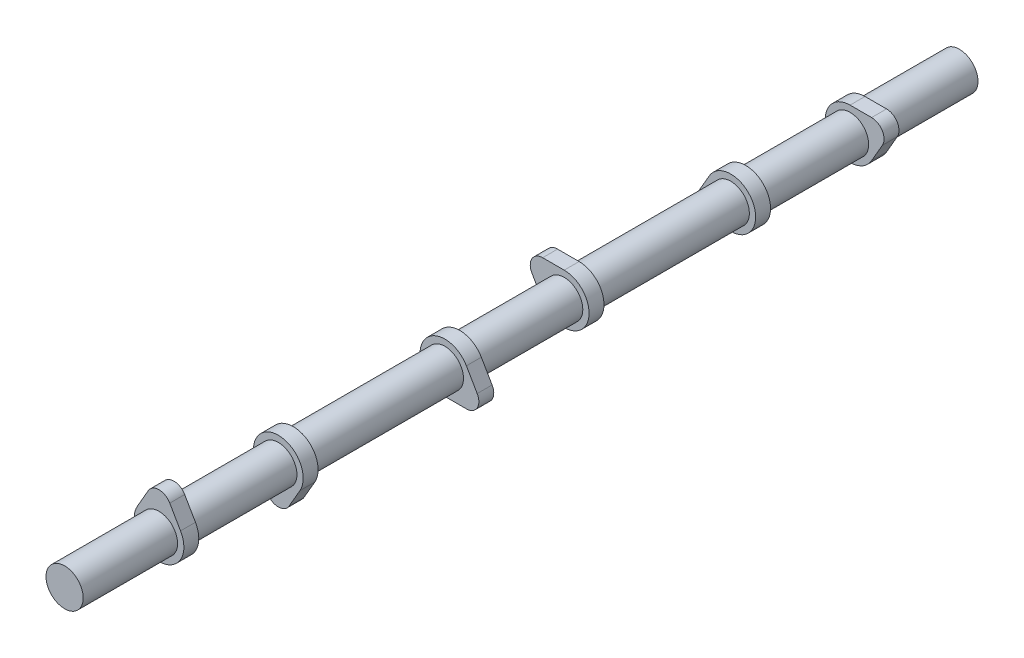
ISO-10303-21;
HEADER;
FILE_DESCRIPTION(('STEP AP214'),'2;1');
FILE_NAME('part.step','',(''),(''),'','','');
FILE_SCHEMA(('AUTOMOTIVE_DESIGN { 1 0 10303 214 1 1 1 1 }'));
ENDSEC;
DATA;
#1=APPLICATION_CONTEXT('core data for automotive mechanical design processes');
#2=APPLICATION_PROTOCOL_DEFINITION('international standard','automotive_design',2000,#1);
#3=PRODUCT_CONTEXT('',#1,'mechanical');
#4=PRODUCT('Part','Part','',(#3));
#5=PRODUCT_RELATED_PRODUCT_CATEGORY('part','',(#4));
#6=PRODUCT_DEFINITION_FORMATION('','',#4);
#7=PRODUCT_DEFINITION_CONTEXT('part definition',#1,'design');
#8=PRODUCT_DEFINITION('design','',#6,#7);
#9=PRODUCT_DEFINITION_SHAPE('','',#8);
#10=(LENGTH_UNIT() NAMED_UNIT(*) SI_UNIT(.MILLI.,.METRE.));
#11=(NAMED_UNIT(*) PLANE_ANGLE_UNIT() SI_UNIT($,.RADIAN.));
#12=(NAMED_UNIT(*) SI_UNIT($,.STERADIAN.) SOLID_ANGLE_UNIT());
#13=UNCERTAINTY_MEASURE_WITH_UNIT(LENGTH_MEASURE(1.E-05),#10,'distance_accuracy_value','');
#14=(GEOMETRIC_REPRESENTATION_CONTEXT(3) GLOBAL_UNCERTAINTY_ASSIGNED_CONTEXT((#13)) GLOBAL_UNIT_ASSIGNED_CONTEXT((#10,
#11,#12)) REPRESENTATION_CONTEXT('',''));
#15=CARTESIAN_POINT('',(0.,0.,0.));
#16=DIRECTION('',(0.,0.,1.));
#17=DIRECTION('',(1.,0.,0.));
#18=AXIS2_PLACEMENT_3D('',#15,#16,#17);
#19=CARTESIAN_POINT('',(0.,0.,-52.02));
#20=DIRECTION('',(0.,0.,1.));
#21=DIRECTION('',(1.,0.,0.));
#22=AXIS2_PLACEMENT_3D('',#19,#20,#21);
#23=CYLINDRICAL_SURFACE('',#22,9.5);
#24=CARTESIAN_POINT('',(0.,0.,295.81));
#25=DIRECTION('',(0.,0.,1.));
#26=DIRECTION('',(1.,0.,0.));
#27=AXIS2_PLACEMENT_3D('',#24,#25,#26);
#28=CIRCLE('',#27,9.5);
#29=CARTESIAN_POINT('',(9.5,0.,295.81));
#30=VERTEX_POINT('',#29);
#31=EDGE_CURVE('E297',#30,#30,#28,.T.);
#32=ORIENTED_EDGE('',*,*,#31,.T.);
#33=EDGE_LOOP('',(#32));
#34=FACE_BOUND('',#33,.T.);
#35=CARTESIAN_POINT('',(0.,0.,349.13));
#36=DIRECTION('',(0.,0.,1.));
#37=DIRECTION('',(1.,0.,0.));
#38=AXIS2_PLACEMENT_3D('',#35,#36,#37);
#39=CIRCLE('',#38,9.5);
#40=CARTESIAN_POINT('',(9.5,0.,349.13));
#41=VERTEX_POINT('',#40);
#42=EDGE_CURVE('E11',#41,#41,#39,.T.);
#43=ORIENTED_EDGE('',*,*,#42,.F.);
#44=EDGE_LOOP('',(#43));
#45=FACE_BOUND('',#44,.T.);
#46=ADVANCED_FACE('F45',(#34,#45),#23,.T.);
#47=CARTESIAN_POINT('',(0.,0.,210.75));
#48=DIRECTION('',(0.,0.,1.));
#49=DIRECTION('',(1.,0.,0.));
#50=AXIS2_PLACEMENT_3D('',#47,#48,#49);
#51=CIRCLE('',#50,9.5);
#52=CARTESIAN_POINT('',(9.5,0.,210.75));
#53=VERTEX_POINT('',#52);
#54=EDGE_CURVE('E340',#53,#53,#51,.T.);
#55=ORIENTED_EDGE('',*,*,#54,.T.);
#56=EDGE_LOOP('',(#55));
#57=FACE_BOUND('',#56,.T.);
#58=CARTESIAN_POINT('',(0.,0.,288.19));
#59=DIRECTION('',(0.,0.,1.));
#60=DIRECTION('',(1.,0.,0.));
#61=AXIS2_PLACEMENT_3D('',#58,#59,#60);
#62=CIRCLE('',#61,9.5);
#63=CARTESIAN_POINT('',(9.5,0.,288.19));
#64=VERTEX_POINT('',#63);
#65=EDGE_CURVE('E56',#64,#64,#62,.T.);
#66=ORIENTED_EDGE('',*,*,#65,.F.);
#67=EDGE_LOOP('',(#66));
#68=FACE_BOUND('',#67,.T.);
#69=ADVANCED_FACE('F539',(#57,#68),#23,.T.);
#70=CARTESIAN_POINT('',(0.,0.,149.81));
#71=DIRECTION('',(0.,0.,1.));
#72=DIRECTION('',(1.,0.,0.));
#73=AXIS2_PLACEMENT_3D('',#70,#71,#72);
#74=CIRCLE('',#73,9.5);
#75=CARTESIAN_POINT('',(9.5,0.,149.81));
#76=VERTEX_POINT('',#75);
#77=EDGE_CURVE('E383',#76,#76,#74,.T.);
#78=ORIENTED_EDGE('',*,*,#77,.T.);
#79=EDGE_LOOP('',(#78));
#80=FACE_BOUND('',#79,.T.);
#81=CARTESIAN_POINT('',(0.,0.,203.13));
#82=DIRECTION('',(0.,0.,1.));
#83=DIRECTION('',(1.,0.,0.));
#84=AXIS2_PLACEMENT_3D('',#81,#82,#83);
#85=CIRCLE('',#84,9.5);
#86=CARTESIAN_POINT('',(9.5,0.,203.13));
#87=VERTEX_POINT('',#86);
#88=EDGE_CURVE('E487',#87,#87,#85,.T.);
#89=ORIENTED_EDGE('',*,*,#88,.F.);
#90=EDGE_LOOP('',(#89));
#91=FACE_BOUND('',#90,.T.);
#92=ADVANCED_FACE('F546',(#80,#91),#23,.T.);
#93=CARTESIAN_POINT('',(0.,0.,64.75));
#94=DIRECTION('',(0.,0.,1.));
#95=DIRECTION('',(1.,0.,0.));
#96=AXIS2_PLACEMENT_3D('',#93,#94,#95);
#97=CIRCLE('',#96,9.5);
#98=CARTESIAN_POINT('',(9.5,0.,64.75));
#99=VERTEX_POINT('',#98);
#100=EDGE_CURVE('E426',#99,#99,#97,.T.);
#101=ORIENTED_EDGE('',*,*,#100,.T.);
#102=EDGE_LOOP('',(#101));
#103=FACE_BOUND('',#102,.T.);
#104=CARTESIAN_POINT('',(0.,0.,142.19));
#105=DIRECTION('',(0.,0.,1.));
#106=DIRECTION('',(1.,0.,0.));
#107=AXIS2_PLACEMENT_3D('',#104,#105,#106);
#108=CIRCLE('',#107,9.5);
#109=CARTESIAN_POINT('',(9.5,0.,142.19));
#110=VERTEX_POINT('',#109);
#111=EDGE_CURVE('E480',#110,#110,#108,.T.);
#112=ORIENTED_EDGE('',*,*,#111,.F.);
#113=EDGE_LOOP('',(#112));
#114=FACE_BOUND('',#113,.T.);
#115=ADVANCED_FACE('F578',(#103,#114),#23,.T.);
#116=CARTESIAN_POINT('',(0.,0.,3.81));
#117=DIRECTION('',(0.,0.,1.));
#118=DIRECTION('',(1.,0.,0.));
#119=AXIS2_PLACEMENT_3D('',#116,#117,#118);
#120=CIRCLE('',#119,9.5);
#121=CARTESIAN_POINT('',(9.5,0.,3.81));
#122=VERTEX_POINT('',#121);
#123=EDGE_CURVE('E431',#122,#122,#120,.F.);
#124=ORIENTED_EDGE('',*,*,#123,.F.);
#125=EDGE_LOOP('',(#124));
#126=FACE_BOUND('',#125,.T.);
#127=CARTESIAN_POINT('',(0.,0.,57.13));
#128=DIRECTION('',(0.,0.,1.));
#129=DIRECTION('',(1.,0.,0.));
#130=AXIS2_PLACEMENT_3D('',#127,#128,#129);
#131=CIRCLE('',#130,9.5);
#132=CARTESIAN_POINT('',(9.5,0.,57.13));
#133=VERTEX_POINT('',#132);
#134=EDGE_CURVE('E476',#133,#133,#131,.T.);
#135=ORIENTED_EDGE('',*,*,#134,.F.);
#136=EDGE_LOOP('',(#135));
#137=FACE_BOUND('',#136,.T.);
#138=ADVANCED_FACE('F564',(#126,#137),#23,.T.);
#139=CARTESIAN_POINT('',(10.9985226280625,6.34999999999982,3.81));
#140=DIRECTION('',(0.,0.,-1.));
#141=DIRECTION('',(-0.499999999999986,0.866025403784447,0.));
#142=AXIS2_PLACEMENT_3D('',#139,#140,#141);
#143=CYLINDRICAL_SURFACE('',#142,6.35);
#144=CARTESIAN_POINT('',(10.9985226280625,6.34999999999982,-3.81));
#145=DIRECTION('',(0.,0.,1.));
#146=DIRECTION('',(0.499999999999986,-0.866025403784447,0.));
#147=AXIS2_PLACEMENT_3D('',#144,#145,#146);
#148=CIRCLE('',#147,6.35);
#149=CARTESIAN_POINT('',(16.4977839420936,3.17499999999973,-3.81));
#150=VERTEX_POINT('',#149);
#151=CARTESIAN_POINT('',(10.9985226280626,12.6999999999998,-3.81));
#152=VERTEX_POINT('',#151);
#153=EDGE_CURVE('E439',#150,#152,#148,.T.);
#154=ORIENTED_EDGE('',*,*,#153,.T.);
#155=DIRECTION('',(0.,0.,-1.));
#156=VECTOR('',#155,1.);
#157=CARTESIAN_POINT('',(10.9985226280626,12.6999999999998,3.81));
#158=LINE('',#157,#156);
#159=CARTESIAN_POINT('',(10.9985226280626,12.6999999999998,3.81));
#160=VERTEX_POINT('',#159);
#161=EDGE_CURVE('E469',#160,#152,#158,.T.);
#162=ORIENTED_EDGE('',*,*,#161,.F.);
#163=CARTESIAN_POINT('',(10.9985226280625,6.34999999999982,3.81));
#164=DIRECTION('',(0.,0.,1.));
#165=DIRECTION('',(0.499999999999986,-0.866025403784447,0.));
#166=AXIS2_PLACEMENT_3D('',#163,#164,#165);
#167=CIRCLE('',#166,6.35);
#168=CARTESIAN_POINT('',(16.4977839420936,3.17499999999973,3.81));
#169=VERTEX_POINT('',#168);
#170=EDGE_CURVE('E440',#169,#160,#167,.T.);
#171=ORIENTED_EDGE('',*,*,#170,.F.);
#172=DIRECTION('',(0.,0.,-1.));
#173=VECTOR('',#172,1.);
#174=CARTESIAN_POINT('',(16.4977839420936,3.17499999999973,3.81));
#175=LINE('',#174,#173);
#176=EDGE_CURVE('E450',#169,#150,#175,.T.);
#177=ORIENTED_EDGE('',*,*,#176,.T.);
#178=EDGE_LOOP('',(#154,#162,#171,#177));
#179=FACE_BOUND('',#178,.T.);
#180=ADVANCED_FACE('F47',(#179),#143,.T.);
#181=CARTESIAN_POINT('',(10.9985226280626,12.6999999999998,3.81));
#182=DIRECTION('',(0.,-1.,0.));
#183=DIRECTION('',(1.,0.,0.));
#184=AXIS2_PLACEMENT_3D('',#181,#182,#183);
#185=PLANE('',#184);
#186=DIRECTION('',(-1.,0.,0.));
#187=VECTOR('',#186,1.);
#188=CARTESIAN_POINT('',(10.9985226280626,12.6999999999998,-3.81));
#189=LINE('',#188,#187);
#190=CARTESIAN_POINT('',(2.05564731903252E-13,12.7,-3.81));
#191=VERTEX_POINT('',#190);
#192=EDGE_CURVE('E454',#152,#191,#189,.T.);
#193=ORIENTED_EDGE('',*,*,#192,.T.);
#194=DIRECTION('',(0.,0.,-1.));
#195=VECTOR('',#194,1.);
#196=CARTESIAN_POINT('',(2.05564731903252E-13,12.7,3.81));
#197=LINE('',#196,#195);
#198=CARTESIAN_POINT('',(2.05564731903252E-13,12.7,3.81));
#199=VERTEX_POINT('',#198);
#200=EDGE_CURVE('E466',#199,#191,#197,.T.);
#201=ORIENTED_EDGE('',*,*,#200,.F.);
#202=DIRECTION('',(-1.,0.,0.));
#203=VECTOR('',#202,1.);
#204=CARTESIAN_POINT('',(10.9985226280626,12.6999999999998,3.81));
#205=LINE('',#204,#203);
#206=EDGE_CURVE('E96',#160,#199,#205,.T.);
#207=ORIENTED_EDGE('',*,*,#206,.F.);
#208=ORIENTED_EDGE('',*,*,#161,.T.);
#209=EDGE_LOOP('',(#193,#201,#207,#208));
#210=FACE_BOUND('',#209,.T.);
#211=ADVANCED_FACE('F585',(#210),#185,.F.);
#212=CARTESIAN_POINT('',(0.,0.,3.81));
#213=DIRECTION('',(0.,0.,-1.));
#214=DIRECTION('',(-0.499999999999986,0.866025403784447,0.));
#215=AXIS2_PLACEMENT_3D('',#212,#213,#214);
#216=CYLINDRICAL_SURFACE('',#215,12.7);
#217=CARTESIAN_POINT('',(0.,0.,-3.81));
#218=DIRECTION('',(0.,0.,1.));
#219=DIRECTION('',(0.499999999999986,-0.866025403784447,0.));
#220=AXIS2_PLACEMENT_3D('',#217,#218,#219);
#221=CIRCLE('',#220,12.7);
#222=CARTESIAN_POINT('',(10.9985226280623,-6.35000000000018,-3.81));
#223=VERTEX_POINT('',#222);
#224=EDGE_CURVE('E82',#191,#223,#221,.T.);
#225=ORIENTED_EDGE('',*,*,#224,.T.);
#226=DIRECTION('',(0.,0.,-1.));
#227=VECTOR('',#226,1.);
#228=CARTESIAN_POINT('',(10.9985226280623,-6.35000000000018,3.81));
#229=LINE('',#228,#227);
#230=CARTESIAN_POINT('',(10.9985226280623,-6.35000000000018,3.81));
#231=VERTEX_POINT('',#230);
#232=EDGE_CURVE('E463',#231,#223,#229,.T.);
#233=ORIENTED_EDGE('',*,*,#232,.F.);
#234=CARTESIAN_POINT('',(0.,0.,3.81));
#235=DIRECTION('',(0.,0.,1.));
#236=DIRECTION('',(0.499999999999986,-0.866025403784447,0.));
#237=AXIS2_PLACEMENT_3D('',#234,#235,#236);
#238=CIRCLE('',#237,12.7);
#239=EDGE_CURVE('E445',#199,#231,#238,.T.);
#240=ORIENTED_EDGE('',*,*,#239,.F.);
#241=ORIENTED_EDGE('',*,*,#200,.T.);
#242=EDGE_LOOP('',(#225,#233,#240,#241));
#243=FACE_BOUND('',#242,.T.);
#244=ADVANCED_FACE('F936',(#243),#216,.T.);
#245=CARTESIAN_POINT('',(16.4977839420936,3.17499999999973,3.81));
#246=DIRECTION('',(-0.86602540378443,0.500000000000014,0.));
#247=DIRECTION('',(-0.500000000000014,-0.86602540378443,0.));
#248=AXIS2_PLACEMENT_3D('',#245,#246,#247);
#249=PLANE('',#248);
#250=DIRECTION('',(0.500000000000014,0.86602540378443,0.));
#251=VECTOR('',#250,1.);
#252=CARTESIAN_POINT('',(16.4977839420936,3.17499999999973,-3.81));
#253=LINE('',#252,#251);
#254=EDGE_CURVE('E88',#223,#150,#253,.T.);
#255=ORIENTED_EDGE('',*,*,#254,.T.);
#256=ORIENTED_EDGE('',*,*,#176,.F.);
#257=DIRECTION('',(0.500000000000014,0.86602540378443,0.));
#258=VECTOR('',#257,1.);
#259=CARTESIAN_POINT('',(16.4977839420936,3.17499999999973,3.81));
#260=LINE('',#259,#258);
#261=EDGE_CURVE('E64',#231,#169,#260,.T.);
#262=ORIENTED_EDGE('',*,*,#261,.F.);
#263=ORIENTED_EDGE('',*,*,#232,.T.);
#264=EDGE_LOOP('',(#255,#256,#262,#263));
#265=FACE_BOUND('',#264,.T.);
#266=ADVANCED_FACE('F920',(#265),#249,.F.);
#267=CARTESIAN_POINT('',(10.9985226280625,6.34999999999982,3.81));
#268=DIRECTION('',(0.,0.,1.));
#269=DIRECTION('',(0.499999999999986,-0.866025403784447,0.));
#270=AXIS2_PLACEMENT_3D('',#267,#268,#269);
#271=PLANE('',#270);
#272=ORIENTED_EDGE('',*,*,#123,.T.);
#273=EDGE_LOOP('',(#272));
#274=FACE_BOUND('',#273,.T.);
#275=ORIENTED_EDGE('',*,*,#170,.T.);
#276=ORIENTED_EDGE('',*,*,#206,.T.);
#277=ORIENTED_EDGE('',*,*,#239,.T.);
#278=ORIENTED_EDGE('',*,*,#261,.T.);
#279=EDGE_LOOP('',(#275,#276,#277,#278));
#280=FACE_BOUND('',#279,.T.);
#281=ADVANCED_FACE('F911',(#274,#280),#271,.T.);
#282=CARTESIAN_POINT('',(10.9985226280625,6.34999999999982,-3.81));
#283=DIRECTION('',(0.,0.,1.));
#284=DIRECTION('',(0.499999999999986,-0.866025403784447,0.));
#285=AXIS2_PLACEMENT_3D('',#282,#283,#284);
#286=PLANE('',#285);
#287=CARTESIAN_POINT('',(0.,0.,-3.81));
#288=DIRECTION('',(0.,0.,1.));
#289=DIRECTION('',(1.,0.,0.));
#290=AXIS2_PLACEMENT_3D('',#287,#288,#289);
#291=CIRCLE('',#290,9.5);
#292=CARTESIAN_POINT('',(9.5,0.,-3.81));
#293=VERTEX_POINT('',#292);
#294=EDGE_CURVE('E472',#293,#293,#291,.F.);
#295=ORIENTED_EDGE('',*,*,#294,.F.);
#296=EDGE_LOOP('',(#295));
#297=FACE_BOUND('',#296,.T.);
#298=ORIENTED_EDGE('',*,*,#153,.F.);
#299=ORIENTED_EDGE('',*,*,#254,.F.);
#300=ORIENTED_EDGE('',*,*,#224,.F.);
#301=ORIENTED_EDGE('',*,*,#192,.F.);
#302=EDGE_LOOP('',(#298,#299,#300,#301));
#303=FACE_BOUND('',#302,.T.);
#304=ADVANCED_FACE('F572',(#297,#303),#286,.F.);
#305=CARTESIAN_POINT('',(0.,0.,-52.02));
#306=DIRECTION('',(0.,0.,-1.));
#307=DIRECTION('',(-1.,0.,0.));
#308=AXIS2_PLACEMENT_3D('',#305,#306,#307);
#309=PLANE('',#308);
#310=CARTESIAN_POINT('',(0.,0.,-52.02));
#311=DIRECTION('',(0.,0.,-1.));
#312=DIRECTION('',(-1.,0.,0.));
#313=AXIS2_PLACEMENT_3D('',#310,#311,#312);
#314=CIRCLE('',#313,9.5);
#315=CARTESIAN_POINT('',(-9.5,0.,-52.02));
#316=VERTEX_POINT('',#315);
#317=EDGE_CURVE('E427',#316,#316,#314,.T.);
#318=ORIENTED_EDGE('',*,*,#317,.T.);
#319=EDGE_LOOP('',(#318));
#320=FACE_BOUND('',#319,.T.);
#321=ADVANCED_FACE('F562',(#320),#309,.T.);
#322=ORIENTED_EDGE('',*,*,#317,.F.);
#323=EDGE_LOOP('',(#322));
#324=FACE_BOUND('',#323,.T.);
#325=ORIENTED_EDGE('',*,*,#294,.T.);
#326=EDGE_LOOP('',(#325));
#327=FACE_BOUND('',#326,.T.);
#328=ADVANCED_FACE('F553',(#324,#327),#23,.T.);
#329=CARTESIAN_POINT('',(-10.9985226280624,-6.3499999999999,64.75));
#330=DIRECTION('',(0.,0.,-1.));
#331=DIRECTION('',(0.499999999999992,-0.866025403784443,0.));
#332=AXIS2_PLACEMENT_3D('',#329,#330,#331);
#333=CYLINDRICAL_SURFACE('',#332,6.35);
#334=CARTESIAN_POINT('',(-10.9985226280624,-6.3499999999999,57.13));
#335=DIRECTION('',(0.,0.,1.));
#336=DIRECTION('',(-0.499999999999992,0.866025403784443,0.));
#337=AXIS2_PLACEMENT_3D('',#334,#335,#336);
#338=CIRCLE('',#337,6.35);
#339=CARTESIAN_POINT('',(-16.4977839420936,-3.17499999999984,57.13));
#340=VERTEX_POINT('',#339);
#341=CARTESIAN_POINT('',(-10.9985226280625,-12.6999999999999,57.13));
#342=VERTEX_POINT('',#341);
#343=EDGE_CURVE('E399',#340,#342,#338,.T.);
#344=ORIENTED_EDGE('',*,*,#343,.T.);
#345=DIRECTION('',(0.,0.,-1.));
#346=VECTOR('',#345,1.);
#347=CARTESIAN_POINT('',(-10.9985226280625,-12.6999999999999,64.75));
#348=LINE('',#347,#346);
#349=CARTESIAN_POINT('',(-10.9985226280625,-12.6999999999999,64.75));
#350=VERTEX_POINT('',#349);
#351=EDGE_CURVE('E422',#350,#342,#348,.T.);
#352=ORIENTED_EDGE('',*,*,#351,.F.);
#353=CARTESIAN_POINT('',(-10.9985226280624,-6.3499999999999,64.75));
#354=DIRECTION('',(0.,0.,1.));
#355=DIRECTION('',(-0.499999999999992,0.866025403784443,0.));
#356=AXIS2_PLACEMENT_3D('',#353,#354,#355);
#357=CIRCLE('',#356,6.35);
#358=CARTESIAN_POINT('',(-16.4977839420936,-3.17499999999984,64.75));
#359=VERTEX_POINT('',#358);
#360=EDGE_CURVE('E384',#359,#350,#357,.T.);
#361=ORIENTED_EDGE('',*,*,#360,.F.);
#362=DIRECTION('',(0.,0.,-1.));
#363=VECTOR('',#362,1.);
#364=CARTESIAN_POINT('',(-16.4977839420936,-3.17499999999984,64.75));
#365=LINE('',#364,#363);
#366=EDGE_CURVE('E398',#359,#340,#365,.T.);
#367=ORIENTED_EDGE('',*,*,#366,.T.);
#368=EDGE_LOOP('',(#344,#352,#361,#367));
#369=FACE_BOUND('',#368,.T.);
#370=ADVANCED_FACE('F561',(#369),#333,.T.);
#371=CARTESIAN_POINT('',(-10.9985226280625,-12.6999999999999,64.75));
#372=DIRECTION('',(0.,1.,0.));
#373=DIRECTION('',(-1.,0.,0.));
#374=AXIS2_PLACEMENT_3D('',#371,#372,#373);
#375=PLANE('',#374);
#376=DIRECTION('',(1.,0.,0.));
#377=VECTOR('',#376,1.);
#378=CARTESIAN_POINT('',(-10.9985226280625,-12.6999999999999,57.13));
#379=LINE('',#378,#377);
#380=CARTESIAN_POINT('',(-1.16226472890446E-13,-12.7,57.13));
#381=VERTEX_POINT('',#380);
#382=EDGE_CURVE('E403',#342,#381,#379,.T.);
#383=ORIENTED_EDGE('',*,*,#382,.T.);
#384=DIRECTION('',(0.,0.,-1.));
#385=VECTOR('',#384,1.);
#386=CARTESIAN_POINT('',(-1.16226472890446E-13,-12.7,64.75));
#387=LINE('',#386,#385);
#388=CARTESIAN_POINT('',(-1.16226472890446E-13,-12.7,64.75));
#389=VERTEX_POINT('',#388);
#390=EDGE_CURVE('E418',#389,#381,#387,.T.);
#391=ORIENTED_EDGE('',*,*,#390,.F.);
#392=DIRECTION('',(1.,0.,0.));
#393=VECTOR('',#392,1.);
#394=CARTESIAN_POINT('',(-10.9985226280625,-12.6999999999999,64.75));
#395=LINE('',#394,#393);
#396=EDGE_CURVE('E388',#350,#389,#395,.T.);
#397=ORIENTED_EDGE('',*,*,#396,.F.);
#398=ORIENTED_EDGE('',*,*,#351,.T.);
#399=EDGE_LOOP('',(#383,#391,#397,#398));
#400=FACE_BOUND('',#399,.T.);
#401=ADVANCED_FACE('F569',(#400),#375,.F.);
#402=CARTESIAN_POINT('',(0.,0.,64.75));
#403=DIRECTION('',(0.,0.,-1.));
#404=DIRECTION('',(0.499999999999992,-0.866025403784443,0.));
#405=AXIS2_PLACEMENT_3D('',#402,#403,#404);
#406=CYLINDRICAL_SURFACE('',#405,12.7);
#407=CARTESIAN_POINT('',(0.,0.,57.13));
#408=DIRECTION('',(0.,0.,1.));
#409=DIRECTION('',(-0.499999999999992,0.866025403784443,0.));
#410=AXIS2_PLACEMENT_3D('',#407,#408,#409);
#411=CIRCLE('',#410,12.7);
#412=CARTESIAN_POINT('',(-10.9985226280623,6.3500000000001,57.13));
#413=VERTEX_POINT('',#412);
#414=EDGE_CURVE('E406',#381,#413,#411,.T.);
#415=ORIENTED_EDGE('',*,*,#414,.T.);
#416=DIRECTION('',(0.,0.,-1.));
#417=VECTOR('',#416,1.);
#418=CARTESIAN_POINT('',(-10.9985226280623,6.3500000000001,64.75));
#419=LINE('',#418,#417);
#420=CARTESIAN_POINT('',(-10.9985226280623,6.3500000000001,64.75));
#421=VERTEX_POINT('',#420);
#422=EDGE_CURVE('E414',#421,#413,#419,.T.);
#423=ORIENTED_EDGE('',*,*,#422,.F.);
#424=CARTESIAN_POINT('',(0.,0.,64.75));
#425=DIRECTION('',(0.,0.,1.));
#426=DIRECTION('',(-0.499999999999992,0.866025403784443,0.));
#427=AXIS2_PLACEMENT_3D('',#424,#425,#426);
#428=CIRCLE('',#427,12.7);
#429=EDGE_CURVE('E392',#389,#421,#428,.T.);
#430=ORIENTED_EDGE('',*,*,#429,.F.);
#431=ORIENTED_EDGE('',*,*,#390,.T.);
#432=EDGE_LOOP('',(#415,#423,#430,#431));
#433=FACE_BOUND('',#432,.T.);
#434=ADVANCED_FACE('F610',(#433),#406,.T.);
#435=CARTESIAN_POINT('',(-16.4977839420936,-3.17499999999984,64.75));
#436=DIRECTION('',(0.866025403784434,-0.500000000000008,0.));
#437=DIRECTION('',(0.500000000000008,0.866025403784434,0.));
#438=AXIS2_PLACEMENT_3D('',#435,#436,#437);
#439=PLANE('',#438);
#440=DIRECTION('',(-0.500000000000008,-0.866025403784434,0.));
#441=VECTOR('',#440,1.);
#442=CARTESIAN_POINT('',(-16.4977839420936,-3.17499999999984,57.13));
#443=LINE('',#442,#441);
#444=EDGE_CURVE('E389',#413,#340,#443,.T.);
#445=ORIENTED_EDGE('',*,*,#444,.T.);
#446=ORIENTED_EDGE('',*,*,#366,.F.);
#447=DIRECTION('',(-0.500000000000008,-0.866025403784434,0.));
#448=VECTOR('',#447,1.);
#449=CARTESIAN_POINT('',(-16.4977839420936,-3.17499999999984,64.75));
#450=LINE('',#449,#448);
#451=EDGE_CURVE('E395',#421,#359,#450,.T.);
#452=ORIENTED_EDGE('',*,*,#451,.F.);
#453=ORIENTED_EDGE('',*,*,#422,.T.);
#454=EDGE_LOOP('',(#445,#446,#452,#453));
#455=FACE_BOUND('',#454,.T.);
#456=ADVANCED_FACE('F606',(#455),#439,.F.);
#457=CARTESIAN_POINT('',(-10.9985226280624,-6.3499999999999,64.75));
#458=DIRECTION('',(0.,0.,1.));
#459=DIRECTION('',(-0.499999999999992,0.866025403784443,0.));
#460=AXIS2_PLACEMENT_3D('',#457,#458,#459);
#461=PLANE('',#460);
#462=ORIENTED_EDGE('',*,*,#100,.F.);
#463=EDGE_LOOP('',(#462));
#464=FACE_BOUND('',#463,.T.);
#465=ORIENTED_EDGE('',*,*,#360,.T.);
#466=ORIENTED_EDGE('',*,*,#396,.T.);
#467=ORIENTED_EDGE('',*,*,#429,.T.);
#468=ORIENTED_EDGE('',*,*,#451,.T.);
#469=EDGE_LOOP('',(#465,#466,#467,#468));
#470=FACE_BOUND('',#469,.T.);
#471=ADVANCED_FACE('F596',(#464,#470),#461,.T.);
#472=CARTESIAN_POINT('',(-10.9985226280624,-6.3499999999999,57.13));
#473=DIRECTION('',(0.,0.,1.));
#474=DIRECTION('',(-0.499999999999992,0.866025403784443,0.));
#475=AXIS2_PLACEMENT_3D('',#472,#473,#474);
#476=PLANE('',#475);
#477=ORIENTED_EDGE('',*,*,#134,.T.);
#478=EDGE_LOOP('',(#477));
#479=FACE_BOUND('',#478,.T.);
#480=ORIENTED_EDGE('',*,*,#343,.F.);
#481=ORIENTED_EDGE('',*,*,#444,.F.);
#482=ORIENTED_EDGE('',*,*,#414,.F.);
#483=ORIENTED_EDGE('',*,*,#382,.F.);
#484=EDGE_LOOP('',(#480,#481,#482,#483));
#485=FACE_BOUND('',#484,.T.);
#486=ADVANCED_FACE('F592',(#479,#485),#476,.F.);
#487=CARTESIAN_POINT('',(-10.9985226280623,6.35000000000013,149.81));
#488=DIRECTION('',(0.,0.,-1.));
#489=DIRECTION('',(-0.50000000000001,-0.866025403784433,0.));
#490=AXIS2_PLACEMENT_3D('',#487,#488,#489);
#491=CYLINDRICAL_SURFACE('',#490,6.35);
#492=CARTESIAN_POINT('',(-10.9985226280623,6.35000000000013,142.19));
#493=DIRECTION('',(0.,0.,1.));
#494=DIRECTION('',(0.50000000000001,0.866025403784433,0.));
#495=AXIS2_PLACEMENT_3D('',#492,#493,#494);
#496=CIRCLE('',#495,6.35);
#497=CARTESIAN_POINT('',(-10.9985226280622,12.7000000000001,142.19));
#498=VERTEX_POINT('',#497);
#499=CARTESIAN_POINT('',(-16.4977839420935,3.17500000000019,142.19));
#500=VERTEX_POINT('',#499);
#501=EDGE_CURVE('E356',#498,#500,#496,.T.);
#502=ORIENTED_EDGE('',*,*,#501,.T.);
#503=DIRECTION('',(0.,0.,-1.));
#504=VECTOR('',#503,1.);
#505=CARTESIAN_POINT('',(-16.4977839420935,3.17500000000019,149.81));
#506=LINE('',#505,#504);
#507=CARTESIAN_POINT('',(-16.4977839420935,3.17500000000019,149.81));
#508=VERTEX_POINT('',#507);
#509=EDGE_CURVE('E379',#508,#500,#506,.T.);
#510=ORIENTED_EDGE('',*,*,#509,.F.);
#511=CARTESIAN_POINT('',(-10.9985226280623,6.35000000000013,149.81));
#512=DIRECTION('',(0.,0.,1.));
#513=DIRECTION('',(0.50000000000001,0.866025403784433,0.));
#514=AXIS2_PLACEMENT_3D('',#511,#512,#513);
#515=CIRCLE('',#514,6.35);
#516=CARTESIAN_POINT('',(-10.9985226280622,12.7000000000001,149.81));
#517=VERTEX_POINT('',#516);
#518=EDGE_CURVE('E341',#517,#508,#515,.T.);
#519=ORIENTED_EDGE('',*,*,#518,.F.);
#520=DIRECTION('',(0.,0.,-1.));
#521=VECTOR('',#520,1.);
#522=CARTESIAN_POINT('',(-10.9985226280622,12.7000000000001,149.81));
#523=LINE('',#522,#521);
#524=EDGE_CURVE('E355',#517,#498,#523,.T.);
#525=ORIENTED_EDGE('',*,*,#524,.T.);
#526=EDGE_LOOP('',(#502,#510,#519,#525));
#527=FACE_BOUND('',#526,.T.);
#528=ADVANCED_FACE('F595',(#527),#491,.T.);
#529=CARTESIAN_POINT('',(-16.4977839420935,3.17500000000019,149.81));
#530=DIRECTION('',(0.866025403784445,0.49999999999999,0.));
#531=DIRECTION('',(-0.49999999999999,0.866025403784445,0.));
#532=AXIS2_PLACEMENT_3D('',#529,#530,#531);
#533=PLANE('',#532);
#534=DIRECTION('',(0.49999999999999,-0.866025403784445,0.));
#535=VECTOR('',#534,1.);
#536=CARTESIAN_POINT('',(-16.4977839420935,3.17500000000019,142.19));
#537=LINE('',#536,#535);
#538=CARTESIAN_POINT('',(-10.9985226280624,-6.34999999999987,142.19));
#539=VERTEX_POINT('',#538);
#540=EDGE_CURVE('E360',#500,#539,#537,.T.);
#541=ORIENTED_EDGE('',*,*,#540,.T.);
#542=DIRECTION('',(0.,0.,-1.));
#543=VECTOR('',#542,1.);
#544=CARTESIAN_POINT('',(-10.9985226280624,-6.34999999999987,149.81));
#545=LINE('',#544,#543);
#546=CARTESIAN_POINT('',(-10.9985226280624,-6.34999999999987,149.81));
#547=VERTEX_POINT('',#546);
#548=EDGE_CURVE('E375',#547,#539,#545,.T.);
#549=ORIENTED_EDGE('',*,*,#548,.F.);
#550=DIRECTION('',(0.49999999999999,-0.866025403784445,0.));
#551=VECTOR('',#550,1.);
#552=CARTESIAN_POINT('',(-16.4977839420935,3.17500000000019,149.81));
#553=LINE('',#552,#551);
#554=EDGE_CURVE('E345',#508,#547,#553,.T.);
#555=ORIENTED_EDGE('',*,*,#554,.F.);
#556=ORIENTED_EDGE('',*,*,#509,.T.);
#557=EDGE_LOOP('',(#541,#549,#555,#556));
#558=FACE_BOUND('',#557,.T.);
#559=ADVANCED_FACE('F662',(#558),#533,.F.);
#560=CARTESIAN_POINT('',(0.,0.,149.81));
#561=DIRECTION('',(0.,0.,-1.));
#562=DIRECTION('',(-0.50000000000001,-0.866025403784433,0.));
#563=AXIS2_PLACEMENT_3D('',#560,#561,#562);
#564=CYLINDRICAL_SURFACE('',#563,12.7);
#565=CARTESIAN_POINT('',(0.,0.,142.19));
#566=DIRECTION('',(0.,0.,1.));
#567=DIRECTION('',(0.50000000000001,0.866025403784433,0.));
#568=AXIS2_PLACEMENT_3D('',#565,#566,#567);
#569=CIRCLE('',#568,12.7);
#570=CARTESIAN_POINT('',(1.44849410244063E-13,12.7,142.19));
#571=VERTEX_POINT('',#570);
#572=EDGE_CURVE('E363',#539,#571,#569,.T.);
#573=ORIENTED_EDGE('',*,*,#572,.T.);
#574=DIRECTION('',(0.,0.,-1.));
#575=VECTOR('',#574,1.);
#576=CARTESIAN_POINT('',(1.44849410244063E-13,12.7,149.81));
#577=LINE('',#576,#575);
#578=CARTESIAN_POINT('',(1.44849410244063E-13,12.7,149.81));
#579=VERTEX_POINT('',#578);
#580=EDGE_CURVE('E371',#579,#571,#577,.T.);
#581=ORIENTED_EDGE('',*,*,#580,.F.);
#582=CARTESIAN_POINT('',(0.,0.,149.81));
#583=DIRECTION('',(0.,0.,1.));
#584=DIRECTION('',(0.50000000000001,0.866025403784433,0.));
#585=AXIS2_PLACEMENT_3D('',#582,#583,#584);
#586=CIRCLE('',#585,12.7);
#587=EDGE_CURVE('E349',#547,#579,#586,.T.);
#588=ORIENTED_EDGE('',*,*,#587,.F.);
#589=ORIENTED_EDGE('',*,*,#548,.T.);
#590=EDGE_LOOP('',(#573,#581,#588,#589));
#591=FACE_BOUND('',#590,.T.);
#592=ADVANCED_FACE('F670',(#591),#564,.T.);
#593=CARTESIAN_POINT('',(-10.9985226280622,12.7000000000001,149.81));
#594=DIRECTION('',(0.,-1.,0.));
#595=DIRECTION('',(1.,0.,0.));
#596=AXIS2_PLACEMENT_3D('',#593,#594,#595);
#597=PLANE('',#596);
#598=DIRECTION('',(-1.,0.,0.));
#599=VECTOR('',#598,1.);
#600=CARTESIAN_POINT('',(-10.9985226280622,12.7000000000001,142.19));
#601=LINE('',#600,#599);
#602=EDGE_CURVE('E346',#571,#498,#601,.T.);
#603=ORIENTED_EDGE('',*,*,#602,.T.);
#604=ORIENTED_EDGE('',*,*,#524,.F.);
#605=DIRECTION('',(-1.,0.,0.));
#606=VECTOR('',#605,1.);
#607=CARTESIAN_POINT('',(-10.9985226280622,12.7000000000001,149.81));
#608=LINE('',#607,#606);
#609=EDGE_CURVE('E352',#579,#517,#608,.T.);
#610=ORIENTED_EDGE('',*,*,#609,.F.);
#611=ORIENTED_EDGE('',*,*,#580,.T.);
#612=EDGE_LOOP('',(#603,#604,#610,#611));
#613=FACE_BOUND('',#612,.T.);
#614=ADVANCED_FACE('F678',(#613),#597,.F.);
#615=CARTESIAN_POINT('',(-10.9985226280623,6.35000000000013,149.81));
#616=DIRECTION('',(0.,0.,1.));
#617=DIRECTION('',(0.50000000000001,0.866025403784433,0.));
#618=AXIS2_PLACEMENT_3D('',#615,#616,#617);
#619=PLANE('',#618);
#620=ORIENTED_EDGE('',*,*,#77,.F.);
#621=EDGE_LOOP('',(#620));
#622=FACE_BOUND('',#621,.T.);
#623=ORIENTED_EDGE('',*,*,#518,.T.);
#624=ORIENTED_EDGE('',*,*,#554,.T.);
#625=ORIENTED_EDGE('',*,*,#587,.T.);
#626=ORIENTED_EDGE('',*,*,#609,.T.);
#627=EDGE_LOOP('',(#623,#624,#625,#626));
#628=FACE_BOUND('',#627,.T.);
#629=ADVANCED_FACE('F687',(#622,#628),#619,.T.);
#630=CARTESIAN_POINT('',(-10.9985226280623,6.35000000000013,142.19));
#631=DIRECTION('',(0.,0.,1.));
#632=DIRECTION('',(0.50000000000001,0.866025403784433,0.));
#633=AXIS2_PLACEMENT_3D('',#630,#631,#632);
#634=PLANE('',#633);
#635=ORIENTED_EDGE('',*,*,#111,.T.);
#636=EDGE_LOOP('',(#635));
#637=FACE_BOUND('',#636,.T.);
#638=ORIENTED_EDGE('',*,*,#501,.F.);
#639=ORIENTED_EDGE('',*,*,#602,.F.);
#640=ORIENTED_EDGE('',*,*,#572,.F.);
#641=ORIENTED_EDGE('',*,*,#540,.F.);
#642=EDGE_LOOP('',(#638,#639,#640,#641));
#643=FACE_BOUND('',#642,.T.);
#644=ADVANCED_FACE('F696',(#637,#643),#634,.F.);
#645=CARTESIAN_POINT('',(10.9985226280623,-6.35000000000005,210.75));
#646=DIRECTION('',(0.,0.,-1.));
#647=DIRECTION('',(0.500000000000004,0.866025403784436,0.));
#648=AXIS2_PLACEMENT_3D('',#645,#646,#647);
#649=CYLINDRICAL_SURFACE('',#648,6.35);
#650=CARTESIAN_POINT('',(10.9985226280623,-6.35000000000005,203.13));
#651=DIRECTION('',(0.,0.,1.));
#652=DIRECTION('',(-0.500000000000004,-0.866025403784436,0.));
#653=AXIS2_PLACEMENT_3D('',#650,#651,#652);
#654=CIRCLE('',#653,6.35);
#655=CARTESIAN_POINT('',(10.9985226280623,-12.7000000000001,203.13));
#656=VERTEX_POINT('',#655);
#657=CARTESIAN_POINT('',(16.4977839420935,-3.17500000000008,203.13));
#658=VERTEX_POINT('',#657);
#659=EDGE_CURVE('E313',#656,#658,#654,.T.);
#660=ORIENTED_EDGE('',*,*,#659,.T.);
#661=DIRECTION('',(0.,0.,-1.));
#662=VECTOR('',#661,1.);
#663=CARTESIAN_POINT('',(16.4977839420935,-3.17500000000008,210.75));
#664=LINE('',#663,#662);
#665=CARTESIAN_POINT('',(16.4977839420935,-3.17500000000008,210.75));
#666=VERTEX_POINT('',#665);
#667=EDGE_CURVE('E336',#666,#658,#664,.T.);
#668=ORIENTED_EDGE('',*,*,#667,.F.);
#669=CARTESIAN_POINT('',(10.9985226280623,-6.35000000000005,210.75));
#670=DIRECTION('',(0.,0.,1.));
#671=DIRECTION('',(-0.500000000000004,-0.866025403784436,0.));
#672=AXIS2_PLACEMENT_3D('',#669,#670,#671);
#673=CIRCLE('',#672,6.35);
#674=CARTESIAN_POINT('',(10.9985226280623,-12.7000000000001,210.75));
#675=VERTEX_POINT('',#674);
#676=EDGE_CURVE('E298',#675,#666,#673,.T.);
#677=ORIENTED_EDGE('',*,*,#676,.F.);
#678=DIRECTION('',(0.,0.,-1.));
#679=VECTOR('',#678,1.);
#680=CARTESIAN_POINT('',(10.9985226280623,-12.7000000000001,210.75));
#681=LINE('',#680,#679);
#682=EDGE_CURVE('E312',#675,#656,#681,.T.);
#683=ORIENTED_EDGE('',*,*,#682,.T.);
#684=EDGE_LOOP('',(#660,#668,#677,#683));
#685=FACE_BOUND('',#684,.T.);
#686=ADVANCED_FACE('F705',(#685),#649,.T.);
#687=CARTESIAN_POINT('',(16.4977839420935,-3.17500000000008,210.75));
#688=DIRECTION('',(-0.866025403784441,-0.499999999999996,0.));
#689=DIRECTION('',(0.499999999999996,-0.866025403784441,0.));
#690=AXIS2_PLACEMENT_3D('',#687,#688,#689);
#691=PLANE('',#690);
#692=DIRECTION('',(-0.499999999999996,0.866025403784441,0.));
#693=VECTOR('',#692,1.);
#694=CARTESIAN_POINT('',(16.4977839420935,-3.17500000000008,203.13));
#695=LINE('',#694,#693);
#696=CARTESIAN_POINT('',(10.9985226280624,6.34999999999995,203.13));
#697=VERTEX_POINT('',#696);
#698=EDGE_CURVE('E317',#658,#697,#695,.T.);
#699=ORIENTED_EDGE('',*,*,#698,.T.);
#700=DIRECTION('',(0.,0.,-1.));
#701=VECTOR('',#700,1.);
#702=CARTESIAN_POINT('',(10.9985226280624,6.34999999999995,210.75));
#703=LINE('',#702,#701);
#704=CARTESIAN_POINT('',(10.9985226280624,6.34999999999995,210.75));
#705=VERTEX_POINT('',#704);
#706=EDGE_CURVE('E332',#705,#697,#703,.T.);
#707=ORIENTED_EDGE('',*,*,#706,.F.);
#708=DIRECTION('',(-0.499999999999996,0.866025403784441,0.));
#709=VECTOR('',#708,1.);
#710=CARTESIAN_POINT('',(16.4977839420935,-3.17500000000008,210.75));
#711=LINE('',#710,#709);
#712=EDGE_CURVE('E302',#666,#705,#711,.T.);
#713=ORIENTED_EDGE('',*,*,#712,.F.);
#714=ORIENTED_EDGE('',*,*,#667,.T.);
#715=EDGE_LOOP('',(#699,#707,#713,#714));
#716=FACE_BOUND('',#715,.T.);
#717=ADVANCED_FACE('F714',(#716),#691,.F.);
#718=CARTESIAN_POINT('',(0.,0.,210.75));
#719=DIRECTION('',(0.,0.,-1.));
#720=DIRECTION('',(0.500000000000004,0.866025403784436,0.));
#721=AXIS2_PLACEMENT_3D('',#718,#719,#720);
#722=CYLINDRICAL_SURFACE('',#721,12.7);
#723=CARTESIAN_POINT('',(0.,0.,203.13));
#724=DIRECTION('',(0.,0.,1.));
#725=DIRECTION('',(-0.500000000000004,-0.866025403784436,0.));
#726=AXIS2_PLACEMENT_3D('',#723,#724,#725);
#727=CIRCLE('',#726,12.7);
#728=CARTESIAN_POINT('',(0.,-12.7,203.13));
#729=VERTEX_POINT('',#728);
#730=EDGE_CURVE('E320',#697,#729,#727,.T.);
#731=ORIENTED_EDGE('',*,*,#730,.T.);
#732=DIRECTION('',(0.,0.,-1.));
#733=VECTOR('',#732,1.);
#734=CARTESIAN_POINT('',(0.,-12.7,210.75));
#735=LINE('',#734,#733);
#736=CARTESIAN_POINT('',(0.,-12.7,210.75));
#737=VERTEX_POINT('',#736);
#738=EDGE_CURVE('E328',#737,#729,#735,.T.);
#739=ORIENTED_EDGE('',*,*,#738,.F.);
#740=CARTESIAN_POINT('',(0.,0.,210.75));
#741=DIRECTION('',(0.,0.,1.));
#742=DIRECTION('',(-0.500000000000004,-0.866025403784436,0.));
#743=AXIS2_PLACEMENT_3D('',#740,#741,#742);
#744=CIRCLE('',#743,12.7);
#745=EDGE_CURVE('E306',#705,#737,#744,.T.);
#746=ORIENTED_EDGE('',*,*,#745,.F.);
#747=ORIENTED_EDGE('',*,*,#706,.T.);
#748=EDGE_LOOP('',(#731,#739,#746,#747));
#749=FACE_BOUND('',#748,.T.);
#750=ADVANCED_FACE('F724',(#749),#722,.T.);
#751=CARTESIAN_POINT('',(10.9985226280623,-12.7000000000001,210.75));
#752=DIRECTION('',(0.,1.,0.));
#753=DIRECTION('',(-1.,0.,0.));
#754=AXIS2_PLACEMENT_3D('',#751,#752,#753);
#755=PLANE('',#754);
#756=DIRECTION('',(1.,0.,0.));
#757=VECTOR('',#756,1.);
#758=CARTESIAN_POINT('',(10.9985226280623,-12.7000000000001,203.13));
#759=LINE('',#758,#757);
#760=EDGE_CURVE('E303',#729,#656,#759,.T.);
#761=ORIENTED_EDGE('',*,*,#760,.T.);
#762=ORIENTED_EDGE('',*,*,#682,.F.);
#763=DIRECTION('',(1.,0.,0.));
#764=VECTOR('',#763,1.);
#765=CARTESIAN_POINT('',(10.9985226280623,-12.7000000000001,210.75));
#766=LINE('',#765,#764);
#767=EDGE_CURVE('E309',#737,#675,#766,.T.);
#768=ORIENTED_EDGE('',*,*,#767,.F.);
#769=ORIENTED_EDGE('',*,*,#738,.T.);
#770=EDGE_LOOP('',(#761,#762,#768,#769));
#771=FACE_BOUND('',#770,.T.);
#772=ADVANCED_FACE('F734',(#771),#755,.F.);
#773=CARTESIAN_POINT('',(10.9985226280623,-6.35000000000005,210.75));
#774=DIRECTION('',(0.,0.,1.));
#775=DIRECTION('',(-0.500000000000004,-0.866025403784436,0.));
#776=AXIS2_PLACEMENT_3D('',#773,#774,#775);
#777=PLANE('',#776);
#778=ORIENTED_EDGE('',*,*,#54,.F.);
#779=EDGE_LOOP('',(#778));
#780=FACE_BOUND('',#779,.T.);
#781=ORIENTED_EDGE('',*,*,#676,.T.);
#782=ORIENTED_EDGE('',*,*,#712,.T.);
#783=ORIENTED_EDGE('',*,*,#745,.T.);
#784=ORIENTED_EDGE('',*,*,#767,.T.);
#785=EDGE_LOOP('',(#781,#782,#783,#784));
#786=FACE_BOUND('',#785,.T.);
#787=ADVANCED_FACE('F744',(#780,#786),#777,.T.);
#788=CARTESIAN_POINT('',(10.9985226280623,-6.35000000000005,203.13));
#789=DIRECTION('',(0.,0.,1.));
#790=DIRECTION('',(-0.500000000000004,-0.866025403784436,0.));
#791=AXIS2_PLACEMENT_3D('',#788,#789,#790);
#792=PLANE('',#791);
#793=ORIENTED_EDGE('',*,*,#88,.T.);
#794=EDGE_LOOP('',(#793));
#795=FACE_BOUND('',#794,.T.);
#796=ORIENTED_EDGE('',*,*,#659,.F.);
#797=ORIENTED_EDGE('',*,*,#760,.F.);
#798=ORIENTED_EDGE('',*,*,#730,.F.);
#799=ORIENTED_EDGE('',*,*,#698,.F.);
#800=EDGE_LOOP('',(#796,#797,#798,#799));
#801=FACE_BOUND('',#800,.T.);
#802=ADVANCED_FACE('F754',(#795,#801),#792,.F.);
#803=CARTESIAN_POINT('',(0.,-12.7,295.81));
#804=DIRECTION('',(0.,0.,-1.));
#805=DIRECTION('',(1.,0.,0.));
#806=AXIS2_PLACEMENT_3D('',#803,#804,#805);
#807=CYLINDRICAL_SURFACE('',#806,6.35);
#808=CARTESIAN_POINT('',(0.,-12.7,288.19));
#809=DIRECTION('',(0.,0.,1.));
#810=DIRECTION('',(-1.,0.,0.));
#811=AXIS2_PLACEMENT_3D('',#808,#809,#810);
#812=CIRCLE('',#811,6.35);
#813=CARTESIAN_POINT('',(-5.4992613140313,-15.875,288.19));
#814=VERTEX_POINT('',#813);
#815=CARTESIAN_POINT('',(5.49926131403107,-15.875,288.19));
#816=VERTEX_POINT('',#815);
#817=EDGE_CURVE('E251',#814,#816,#812,.T.);
#818=ORIENTED_EDGE('',*,*,#817,.T.);
#819=DIRECTION('',(0.,0.,-1.));
#820=VECTOR('',#819,1.);
#821=CARTESIAN_POINT('',(5.49926131403107,-15.875,295.81));
#822=LINE('',#821,#820);
#823=CARTESIAN_POINT('',(5.49926131403107,-15.875,295.81));
#824=VERTEX_POINT('',#823);
#825=EDGE_CURVE('E293',#824,#816,#822,.T.);
#826=ORIENTED_EDGE('',*,*,#825,.F.);
#827=CARTESIAN_POINT('',(0.,-12.7,295.81));
#828=DIRECTION('',(0.,0.,1.));
#829=DIRECTION('',(-1.,0.,0.));
#830=AXIS2_PLACEMENT_3D('',#827,#828,#829);
#831=CIRCLE('',#830,6.35);
#832=CARTESIAN_POINT('',(-5.4992613140313,-15.875,295.81));
#833=VERTEX_POINT('',#832);
#834=EDGE_CURVE('E256',#833,#824,#831,.T.);
#835=ORIENTED_EDGE('',*,*,#834,.F.);
#836=DIRECTION('',(0.,0.,-1.));
#837=VECTOR('',#836,1.);
#838=CARTESIAN_POINT('',(-5.4992613140313,-15.875,295.81));
#839=LINE('',#838,#837);
#840=EDGE_CURVE('E270',#833,#814,#839,.T.);
#841=ORIENTED_EDGE('',*,*,#840,.T.);
#842=EDGE_LOOP('',(#818,#826,#835,#841));
#843=FACE_BOUND('',#842,.T.);
#844=ADVANCED_FACE('F518',(#843),#807,.T.);
#845=CARTESIAN_POINT('',(5.49926131403107,-15.875,295.81));
#846=DIRECTION('',(-0.866025403784435,0.500000000000006,0.));
#847=DIRECTION('',(-0.500000000000006,-0.866025403784435,0.));
#848=AXIS2_PLACEMENT_3D('',#845,#846,#847);
#849=PLANE('',#848);
#850=DIRECTION('',(0.500000000000006,0.866025403784435,0.));
#851=VECTOR('',#850,1.);
#852=CARTESIAN_POINT('',(5.49926131403107,-15.875,288.19));
#853=LINE('',#852,#851);
#854=CARTESIAN_POINT('',(10.9985226280623,-6.35000000000008,288.19));
#855=VERTEX_POINT('',#854);
#856=EDGE_CURVE('E274',#816,#855,#853,.T.);
#857=ORIENTED_EDGE('',*,*,#856,.T.);
#858=DIRECTION('',(0.,0.,-1.));
#859=VECTOR('',#858,1.);
#860=CARTESIAN_POINT('',(10.9985226280623,-6.35000000000008,295.81));
#861=LINE('',#860,#859);
#862=CARTESIAN_POINT('',(10.9985226280623,-6.35000000000008,295.81));
#863=VERTEX_POINT('',#862);
#864=EDGE_CURVE('E289',#863,#855,#861,.T.);
#865=ORIENTED_EDGE('',*,*,#864,.F.);
#866=DIRECTION('',(0.500000000000006,0.866025403784435,0.));
#867=VECTOR('',#866,1.);
#868=CARTESIAN_POINT('',(5.49926131403107,-15.875,295.81));
#869=LINE('',#868,#867);
#870=EDGE_CURVE('E260',#824,#863,#869,.T.);
#871=ORIENTED_EDGE('',*,*,#870,.F.);
#872=ORIENTED_EDGE('',*,*,#825,.T.);
#873=EDGE_LOOP('',(#857,#865,#871,#872));
#874=FACE_BOUND('',#873,.T.);
#875=ADVANCED_FACE('F521',(#874),#849,.F.);
#876=CARTESIAN_POINT('',(0.,0.,295.81));
#877=DIRECTION('',(0.,0.,-1.));
#878=DIRECTION('',(1.,0.,0.));
#879=AXIS2_PLACEMENT_3D('',#876,#877,#878);
#880=CYLINDRICAL_SURFACE('',#879,12.7);
#881=CARTESIAN_POINT('',(0.,0.,288.19));
#882=DIRECTION('',(0.,0.,1.));
#883=DIRECTION('',(-1.,0.,0.));
#884=AXIS2_PLACEMENT_3D('',#881,#882,#883);
#885=CIRCLE('',#884,12.7);
#886=CARTESIAN_POINT('',(-10.9985226280624,-6.34999999999993,288.19));
#887=VERTEX_POINT('',#886);
#888=EDGE_CURVE('E277',#855,#887,#885,.T.);
#889=ORIENTED_EDGE('',*,*,#888,.T.);
#890=DIRECTION('',(0.,0.,-1.));
#891=VECTOR('',#890,1.);
#892=CARTESIAN_POINT('',(-10.9985226280624,-6.34999999999993,295.81));
#893=LINE('',#892,#891);
#894=CARTESIAN_POINT('',(-10.9985226280624,-6.34999999999993,295.81));
#895=VERTEX_POINT('',#894);
#896=EDGE_CURVE('E285',#895,#887,#893,.T.);
#897=ORIENTED_EDGE('',*,*,#896,.F.);
#898=CARTESIAN_POINT('',(0.,0.,295.81));
#899=DIRECTION('',(0.,0.,1.));
#900=DIRECTION('',(-1.,0.,0.));
#901=AXIS2_PLACEMENT_3D('',#898,#899,#900);
#902=CIRCLE('',#901,12.7);
#903=EDGE_CURVE('E264',#863,#895,#902,.T.);
#904=ORIENTED_EDGE('',*,*,#903,.F.);
#905=ORIENTED_EDGE('',*,*,#864,.T.);
#906=EDGE_LOOP('',(#889,#897,#904,#905));
#907=FACE_BOUND('',#906,.T.);
#908=ADVANCED_FACE('F526',(#907),#880,.T.);
#909=CARTESIAN_POINT('',(-5.4992613140313,-15.875,295.81));
#910=DIRECTION('',(0.866025403784442,0.499999999999994,0.));
#911=DIRECTION('',(-0.499999999999994,0.866025403784442,0.));
#912=AXIS2_PLACEMENT_3D('',#909,#910,#911);
#913=PLANE('',#912);
#914=DIRECTION('',(0.499999999999994,-0.866025403784442,0.));
#915=VECTOR('',#914,1.);
#916=CARTESIAN_POINT('',(-5.4992613140313,-15.875,288.19));
#917=LINE('',#916,#915);
#918=EDGE_CURVE('E261',#887,#814,#917,.T.);
#919=ORIENTED_EDGE('',*,*,#918,.T.);
#920=ORIENTED_EDGE('',*,*,#840,.F.);
#921=DIRECTION('',(0.499999999999994,-0.866025403784442,0.));
#922=VECTOR('',#921,1.);
#923=CARTESIAN_POINT('',(-5.4992613140313,-15.875,295.81));
#924=LINE('',#923,#922);
#925=EDGE_CURVE('E267',#895,#833,#924,.T.);
#926=ORIENTED_EDGE('',*,*,#925,.F.);
#927=ORIENTED_EDGE('',*,*,#896,.T.);
#928=EDGE_LOOP('',(#919,#920,#926,#927));
#929=FACE_BOUND('',#928,.T.);
#930=ADVANCED_FACE('F510',(#929),#913,.F.);
#931=CARTESIAN_POINT('',(0.,-12.7,295.81));
#932=DIRECTION('',(0.,0.,1.));
#933=DIRECTION('',(-1.,0.,0.));
#934=AXIS2_PLACEMENT_3D('',#931,#932,#933);
#935=PLANE('',#934);
#936=ORIENTED_EDGE('',*,*,#31,.F.);
#937=EDGE_LOOP('',(#936));
#938=FACE_BOUND('',#937,.T.);
#939=ORIENTED_EDGE('',*,*,#834,.T.);
#940=ORIENTED_EDGE('',*,*,#870,.T.);
#941=ORIENTED_EDGE('',*,*,#903,.T.);
#942=ORIENTED_EDGE('',*,*,#925,.T.);
#943=EDGE_LOOP('',(#939,#940,#941,#942));
#944=FACE_BOUND('',#943,.T.);
#945=ADVANCED_FACE('F506',(#938,#944),#935,.T.);
#946=CARTESIAN_POINT('',(0.,-12.7,288.19));
#947=DIRECTION('',(0.,0.,1.));
#948=DIRECTION('',(-1.,0.,0.));
#949=AXIS2_PLACEMENT_3D('',#946,#947,#948);
#950=PLANE('',#949);
#951=ORIENTED_EDGE('',*,*,#65,.T.);
#952=EDGE_LOOP('',(#951));
#953=FACE_BOUND('',#952,.T.);
#954=ORIENTED_EDGE('',*,*,#817,.F.);
#955=ORIENTED_EDGE('',*,*,#918,.F.);
#956=ORIENTED_EDGE('',*,*,#888,.F.);
#957=ORIENTED_EDGE('',*,*,#856,.F.);
#958=EDGE_LOOP('',(#954,#955,#956,#957));
#959=FACE_BOUND('',#958,.T.);
#960=ADVANCED_FACE('F509',(#953,#959),#950,.F.);
#961=CARTESIAN_POINT('',(0.,12.7,356.75));
#962=DIRECTION('',(0.,0.,-1.));
#963=DIRECTION('',(-1.,0.,0.));
#964=AXIS2_PLACEMENT_3D('',#961,#962,#963);
#965=CYLINDRICAL_SURFACE('',#964,6.35);
#966=CARTESIAN_POINT('',(0.,12.7,349.13));
#967=DIRECTION('',(0.,0.,1.));
#968=DIRECTION('',(1.,0.,0.));
#969=AXIS2_PLACEMENT_3D('',#966,#967,#968);
#970=CIRCLE('',#969,6.35);
#971=CARTESIAN_POINT('',(5.49926131403119,15.875,349.13));
#972=VERTEX_POINT('',#971);
#973=CARTESIAN_POINT('',(-5.49926131403118,15.875,349.13));
#974=VERTEX_POINT('',#973);
#975=EDGE_CURVE('E245',#972,#974,#970,.T.);
#976=ORIENTED_EDGE('',*,*,#975,.T.);
#977=DIRECTION('',(0.,0.,-1.));
#978=VECTOR('',#977,1.);
#979=CARTESIAN_POINT('',(-5.49926131403118,15.875,356.75));
#980=LINE('',#979,#978);
#981=CARTESIAN_POINT('',(-5.49926131403118,15.875,356.75));
#982=VERTEX_POINT('',#981);
#983=EDGE_CURVE('E223',#982,#974,#980,.T.);
#984=ORIENTED_EDGE('',*,*,#983,.F.);
#985=CARTESIAN_POINT('',(0.,12.7,356.75));
#986=DIRECTION('',(0.,0.,1.));
#987=DIRECTION('',(1.,0.,0.));
#988=AXIS2_PLACEMENT_3D('',#985,#986,#987);
#989=CIRCLE('',#988,6.35);
#990=CARTESIAN_POINT('',(5.49926131403119,15.875,356.75));
#991=VERTEX_POINT('',#990);
#992=EDGE_CURVE('E231',#991,#982,#989,.T.);
#993=ORIENTED_EDGE('',*,*,#992,.F.);
#994=DIRECTION('',(0.,0.,-1.));
#995=VECTOR('',#994,1.);
#996=CARTESIAN_POINT('',(5.49926131403119,15.875,356.75));
#997=LINE('',#996,#995);
#998=EDGE_CURVE('E1011',#991,#972,#997,.T.);
#999=ORIENTED_EDGE('',*,*,#998,.T.);
#1000=EDGE_LOOP('',(#976,#984,#993,#999));
#1001=FACE_BOUND('',#1000,.T.);
#1002=ADVANCED_FACE('F243',(#1001),#965,.T.);
#1003=CARTESIAN_POINT('',(-5.49926131403118,15.875,356.75));
#1004=DIRECTION('',(0.866025403784439,-0.5,0.));
#1005=DIRECTION('',(0.5,0.866025403784439,0.));
#1006=AXIS2_PLACEMENT_3D('',#1003,#1004,#1005);
#1007=PLANE('',#1006);
#1008=DIRECTION('',(-0.5,-0.866025403784439,0.));
#1009=VECTOR('',#1008,1.);
#1010=CARTESIAN_POINT('',(-5.49926131403118,15.875,349.13));
#1011=LINE('',#1010,#1009);
#1012=CARTESIAN_POINT('',(-10.9985226280624,6.35,349.13));
#1013=VERTEX_POINT('',#1012);
#1014=EDGE_CURVE('E998',#974,#1013,#1011,.T.);
#1015=ORIENTED_EDGE('',*,*,#1014,.T.);
#1016=DIRECTION('',(0.,0.,-1.));
#1017=VECTOR('',#1016,1.);
#1018=CARTESIAN_POINT('',(-10.9985226280624,6.35,356.75));
#1019=LINE('',#1018,#1017);
#1020=CARTESIAN_POINT('',(-10.9985226280624,6.35,356.75));
#1021=VERTEX_POINT('',#1020);
#1022=EDGE_CURVE('E226',#1021,#1013,#1019,.T.);
#1023=ORIENTED_EDGE('',*,*,#1022,.F.);
#1024=DIRECTION('',(-0.5,-0.866025403784439,0.));
#1025=VECTOR('',#1024,1.);
#1026=CARTESIAN_POINT('',(-5.49926131403118,15.875,356.75));
#1027=LINE('',#1026,#1025);
#1028=EDGE_CURVE('E219',#982,#1021,#1027,.T.);
#1029=ORIENTED_EDGE('',*,*,#1028,.F.);
#1030=ORIENTED_EDGE('',*,*,#983,.T.);
#1031=EDGE_LOOP('',(#1015,#1023,#1029,#1030));
#1032=FACE_BOUND('',#1031,.T.);
#1033=ADVANCED_FACE('F221',(#1032),#1007,.F.);
#1034=CARTESIAN_POINT('',(0.,0.,356.75));
#1035=DIRECTION('',(0.,0.,-1.));
#1036=DIRECTION('',(-1.,0.,0.));
#1037=AXIS2_PLACEMENT_3D('',#1034,#1035,#1036);
#1038=CYLINDRICAL_SURFACE('',#1037,12.7);
#1039=CARTESIAN_POINT('',(0.,0.,349.13));
#1040=DIRECTION('',(0.,0.,1.));
#1041=DIRECTION('',(1.,0.,0.));
#1042=AXIS2_PLACEMENT_3D('',#1039,#1040,#1041);
#1043=CIRCLE('',#1042,12.7);
#1044=CARTESIAN_POINT('',(10.9985226280624,6.35,349.13));
#1045=VERTEX_POINT('',#1044);
#1046=EDGE_CURVE('E1002',#1013,#1045,#1043,.T.);
#1047=ORIENTED_EDGE('',*,*,#1046,.T.);
#1048=DIRECTION('',(0.,0.,-1.));
#1049=VECTOR('',#1048,1.);
#1050=CARTESIAN_POINT('',(10.9985226280624,6.35,356.75));
#1051=LINE('',#1050,#1049);
#1052=CARTESIAN_POINT('',(10.9985226280624,6.35,356.75));
#1053=VERTEX_POINT('',#1052);
#1054=EDGE_CURVE('E252',#1053,#1045,#1051,.T.);
#1055=ORIENTED_EDGE('',*,*,#1054,.F.);
#1056=CARTESIAN_POINT('',(0.,0.,356.75));
#1057=DIRECTION('',(0.,0.,1.));
#1058=DIRECTION('',(1.,0.,0.));
#1059=AXIS2_PLACEMENT_3D('',#1056,#1057,#1058);
#1060=CIRCLE('',#1059,12.7);
#1061=EDGE_CURVE('E230',#1021,#1053,#1060,.T.);
#1062=ORIENTED_EDGE('',*,*,#1061,.F.);
#1063=ORIENTED_EDGE('',*,*,#1022,.T.);
#1064=EDGE_LOOP('',(#1047,#1055,#1062,#1063));
#1065=FACE_BOUND('',#1064,.T.);
#1066=ADVANCED_FACE('F819',(#1065),#1038,.T.);
#1067=CARTESIAN_POINT('',(5.49926131403119,15.875,356.75));
#1068=DIRECTION('',(-0.866025403784439,-0.5,0.));
#1069=DIRECTION('',(0.5,-0.866025403784439,0.));
#1070=AXIS2_PLACEMENT_3D('',#1067,#1068,#1069);
#1071=PLANE('',#1070);
#1072=DIRECTION('',(-0.5,0.866025403784439,0.));
#1073=VECTOR('',#1072,1.);
#1074=CARTESIAN_POINT('',(5.49926131403119,15.875,349.13));
#1075=LINE('',#1074,#1073);
#1076=EDGE_CURVE('E241',#1045,#972,#1075,.T.);
#1077=ORIENTED_EDGE('',*,*,#1076,.T.);
#1078=ORIENTED_EDGE('',*,*,#998,.F.);
#1079=DIRECTION('',(-0.5,0.866025403784439,0.));
#1080=VECTOR('',#1079,1.);
#1081=CARTESIAN_POINT('',(5.49926131403119,15.875,356.75));
#1082=LINE('',#1081,#1080);
#1083=EDGE_CURVE('E236',#1053,#991,#1082,.T.);
#1084=ORIENTED_EDGE('',*,*,#1083,.F.);
#1085=ORIENTED_EDGE('',*,*,#1054,.T.);
#1086=EDGE_LOOP('',(#1077,#1078,#1084,#1085));
#1087=FACE_BOUND('',#1086,.T.);
#1088=ADVANCED_FACE('F827',(#1087),#1071,.F.);
#1089=CARTESIAN_POINT('',(0.,12.7,356.75));
#1090=DIRECTION('',(0.,0.,1.));
#1091=DIRECTION('',(1.,0.,0.));
#1092=AXIS2_PLACEMENT_3D('',#1089,#1090,#1091);
#1093=PLANE('',#1092);
#1094=CARTESIAN_POINT('',(0.,0.,356.75));
#1095=DIRECTION('',(0.,0.,1.));
#1096=DIRECTION('',(1.,0.,0.));
#1097=AXIS2_PLACEMENT_3D('',#1094,#1095,#1096);
#1098=CIRCLE('',#1097,9.5);
#1099=CARTESIAN_POINT('',(9.5,0.,356.75));
#1100=VERTEX_POINT('',#1099);
#1101=EDGE_CURVE('E49',#1100,#1100,#1098,.T.);
#1102=ORIENTED_EDGE('',*,*,#1101,.F.);
#1103=EDGE_LOOP('',(#1102));
#1104=FACE_BOUND('',#1103,.T.);
#1105=ORIENTED_EDGE('',*,*,#992,.T.);
#1106=ORIENTED_EDGE('',*,*,#1028,.T.);
#1107=ORIENTED_EDGE('',*,*,#1061,.T.);
#1108=ORIENTED_EDGE('',*,*,#1083,.T.);
#1109=EDGE_LOOP('',(#1105,#1106,#1107,#1108));
#1110=FACE_BOUND('',#1109,.T.);
#1111=ADVANCED_FACE('F234',(#1104,#1110),#1093,.T.);
#1112=CARTESIAN_POINT('',(0.,12.7,349.13));
#1113=DIRECTION('',(0.,0.,1.));
#1114=DIRECTION('',(1.,0.,0.));
#1115=AXIS2_PLACEMENT_3D('',#1112,#1113,#1114);
#1116=PLANE('',#1115);
#1117=ORIENTED_EDGE('',*,*,#42,.T.);
#1118=EDGE_LOOP('',(#1117));
#1119=FACE_BOUND('',#1118,.T.);
#1120=ORIENTED_EDGE('',*,*,#975,.F.);
#1121=ORIENTED_EDGE('',*,*,#1076,.F.);
#1122=ORIENTED_EDGE('',*,*,#1046,.F.);
#1123=ORIENTED_EDGE('',*,*,#1014,.F.);
#1124=EDGE_LOOP('',(#1120,#1121,#1122,#1123));
#1125=FACE_BOUND('',#1124,.T.);
#1126=ADVANCED_FACE('F557',(#1119,#1125),#1116,.F.);
#1127=CARTESIAN_POINT('',(0.,0.,404.96));
#1128=DIRECTION('',(0.,0.,-1.));
#1129=DIRECTION('',(-1.,0.,0.));
#1130=AXIS2_PLACEMENT_3D('',#1127,#1128,#1129);
#1131=PLANE('',#1130);
#1132=CARTESIAN_POINT('',(0.,0.,404.96));
#1133=DIRECTION('',(0.,0.,-1.));
#1134=DIRECTION('',(-1.,0.,0.));
#1135=AXIS2_PLACEMENT_3D('',#1132,#1133,#1134);
#1136=CIRCLE('',#1135,9.5);
#1137=CARTESIAN_POINT('',(-9.5,0.,404.96));
#1138=VERTEX_POINT('',#1137);
#1139=EDGE_CURVE('E432',#1138,#1138,#1136,.T.);
#1140=ORIENTED_EDGE('',*,*,#1139,.F.);
#1141=EDGE_LOOP('',(#1140));
#1142=FACE_BOUND('',#1141,.T.);
#1143=ADVANCED_FACE('F551',(#1142),#1131,.F.);
#1144=ORIENTED_EDGE('',*,*,#1101,.T.);
#1145=EDGE_LOOP('',(#1144));
#1146=FACE_BOUND('',#1145,.T.);
#1147=ORIENTED_EDGE('',*,*,#1139,.T.);
#1148=EDGE_LOOP('',(#1147));
#1149=FACE_BOUND('',#1148,.T.);
#1150=ADVANCED_FACE('F541',(#1146,#1149),#23,.T.);
#1151=CLOSED_SHELL('',(#46,#69,#92,#115,#138,#180,#211,#244,#266,#281,#304,#321,#328,#370,#401,
#434,#456,#471,#486,#528,#559,#592,#614,#629,#644,#686,#717,#750,#772,#787,#802,#844,#875,#908,
#930,#945,#960,#1002,#1033,#1066,#1088,#1111,#1126,#1143,#1150));
#1152=MANIFOLD_SOLID_BREP('B2',#1151);
#1153=ADVANCED_BREP_SHAPE_REPRESENTATION('',(#18,#1152),#14);
#1154=SHAPE_DEFINITION_REPRESENTATION(#9,#1153);
ENDSEC;
END-ISO-10303-21;
